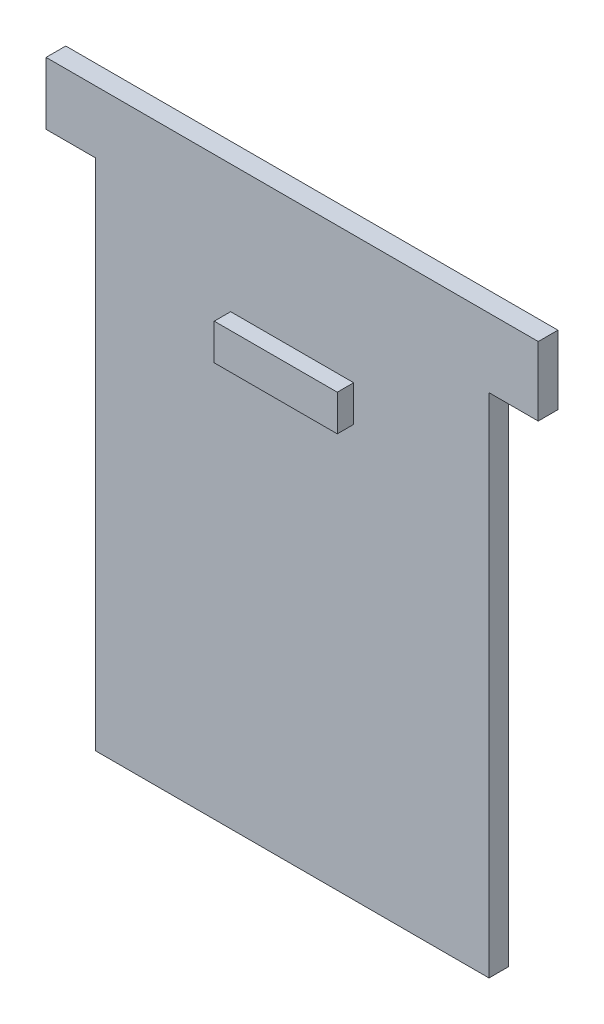
ISO-10303-21;
HEADER;
FILE_DESCRIPTION(('STEP AP214'),'2;1');
FILE_NAME('part.step','',(''),(''),'','','');
FILE_SCHEMA(('AUTOMOTIVE_DESIGN { 1 0 10303 214 1 1 1 1 }'));
ENDSEC;
DATA;
#1=APPLICATION_CONTEXT('core data for automotive mechanical design processes');
#2=APPLICATION_PROTOCOL_DEFINITION('international standard','automotive_design',2000,#1);
#3=PRODUCT_CONTEXT('',#1,'mechanical');
#4=PRODUCT('Part','Part','',(#3));
#5=PRODUCT_RELATED_PRODUCT_CATEGORY('part','',(#4));
#6=PRODUCT_DEFINITION_FORMATION('','',#4);
#7=PRODUCT_DEFINITION_CONTEXT('part definition',#1,'design');
#8=PRODUCT_DEFINITION('design','',#6,#7);
#9=PRODUCT_DEFINITION_SHAPE('','',#8);
#10=(LENGTH_UNIT() NAMED_UNIT(*) SI_UNIT(.MILLI.,.METRE.));
#11=(NAMED_UNIT(*) PLANE_ANGLE_UNIT() SI_UNIT($,.RADIAN.));
#12=(NAMED_UNIT(*) SI_UNIT($,.STERADIAN.) SOLID_ANGLE_UNIT());
#13=UNCERTAINTY_MEASURE_WITH_UNIT(LENGTH_MEASURE(1.E-05),#10,'distance_accuracy_value','');
#14=(GEOMETRIC_REPRESENTATION_CONTEXT(3) GLOBAL_UNCERTAINTY_ASSIGNED_CONTEXT((#13)) GLOBAL_UNIT_ASSIGNED_CONTEXT((#10,
#11,#12)) REPRESENTATION_CONTEXT('',''));
#15=CARTESIAN_POINT('',(0.,0.,0.));
#16=DIRECTION('',(0.,0.,1.));
#17=DIRECTION('',(1.,0.,0.));
#18=AXIS2_PLACEMENT_3D('',#15,#16,#17);
#19=CARTESIAN_POINT('',(0.,0.,12.));
#20=DIRECTION('',(0.,0.,-1.));
#21=DIRECTION('',(-1.,0.,0.));
#22=AXIS2_PLACEMENT_3D('',#19,#20,#21);
#23=PLANE('',#22);
#24=DIRECTION('',(0.,-1.,0.));
#25=VECTOR('',#24,1.);
#26=CARTESIAN_POINT('',(0.,-38.,12.));
#27=LINE('',#26,#25);
#28=CARTESIAN_POINT('',(0.,0.,12.));
#29=VERTEX_POINT('',#28);
#30=CARTESIAN_POINT('',(0.,-38.,12.));
#31=VERTEX_POINT('',#30);
#32=EDGE_CURVE('E160',#29,#31,#27,.T.);
#33=ORIENTED_EDGE('',*,*,#32,.T.);
#34=DIRECTION('',(1.,0.,0.));
#35=VECTOR('',#34,1.);
#36=CARTESIAN_POINT('',(30.,-38.,12.));
#37=LINE('',#36,#35);
#38=CARTESIAN_POINT('',(30.,-38.,12.));
#39=VERTEX_POINT('',#38);
#40=EDGE_CURVE('E163',#31,#39,#37,.T.);
#41=ORIENTED_EDGE('',*,*,#40,.T.);
#42=DIRECTION('',(0.,-1.,0.));
#43=VECTOR('',#42,1.);
#44=CARTESIAN_POINT('',(30.,-351.,12.));
#45=LINE('',#44,#43);
#46=CARTESIAN_POINT('',(30.,-351.,12.));
#47=VERTEX_POINT('',#46);
#48=EDGE_CURVE('E166',#39,#47,#45,.T.);
#49=ORIENTED_EDGE('',*,*,#48,.T.);
#50=DIRECTION('',(1.,0.,0.));
#51=VECTOR('',#50,1.);
#52=CARTESIAN_POINT('',(270.,-351.,12.));
#53=LINE('',#52,#51);
#54=CARTESIAN_POINT('',(270.,-351.,12.));
#55=VERTEX_POINT('',#54);
#56=EDGE_CURVE('E168',#47,#55,#53,.T.);
#57=ORIENTED_EDGE('',*,*,#56,.T.);
#58=DIRECTION('',(0.,1.,0.));
#59=VECTOR('',#58,1.);
#60=CARTESIAN_POINT('',(270.,-42.,12.));
#61=LINE('',#60,#59);
#62=CARTESIAN_POINT('',(270.,-42.,12.));
#63=VERTEX_POINT('',#62);
#64=EDGE_CURVE('E170',#55,#63,#61,.T.);
#65=ORIENTED_EDGE('',*,*,#64,.T.);
#66=DIRECTION('',(1.,0.,0.));
#67=VECTOR('',#66,1.);
#68=CARTESIAN_POINT('',(300.,-42.,12.));
#69=LINE('',#68,#67);
#70=CARTESIAN_POINT('',(300.,-42.,12.));
#71=VERTEX_POINT('',#70);
#72=EDGE_CURVE('E172',#63,#71,#69,.T.);
#73=ORIENTED_EDGE('',*,*,#72,.T.);
#74=DIRECTION('',(0.,1.,0.));
#75=VECTOR('',#74,1.);
#76=CARTESIAN_POINT('',(300.,0.,12.));
#77=LINE('',#76,#75);
#78=CARTESIAN_POINT('',(300.,0.,12.));
#79=VERTEX_POINT('',#78);
#80=EDGE_CURVE('E174',#71,#79,#77,.T.);
#81=ORIENTED_EDGE('',*,*,#80,.T.);
#82=DIRECTION('',(-1.,0.,0.));
#83=VECTOR('',#82,1.);
#84=CARTESIAN_POINT('',(0.,0.,12.));
#85=LINE('',#84,#83);
#86=EDGE_CURVE('E176',#79,#29,#85,.T.);
#87=ORIENTED_EDGE('',*,*,#86,.T.);
#88=EDGE_LOOP('',(#33,#41,#49,#57,#65,#73,#81,#87));
#89=FACE_BOUND('',#88,.T.);
#90=DIRECTION('',(0.,-1.,0.));
#91=VECTOR('',#90,1.);
#92=CARTESIAN_POINT('',(112.5,-78.,12.));
#93=LINE('',#92,#91);
#94=CARTESIAN_POINT('',(112.5,-78.,12.));
#95=VERTEX_POINT('',#94);
#96=CARTESIAN_POINT('',(112.5,-100.,12.));
#97=VERTEX_POINT('',#96);
#98=EDGE_CURVE('E150',#95,#97,#93,.T.);
#99=ORIENTED_EDGE('',*,*,#98,.F.);
#100=DIRECTION('',(-1.,0.,0.));
#101=VECTOR('',#100,1.);
#102=CARTESIAN_POINT('',(112.5,-78.,12.));
#103=LINE('',#102,#101);
#104=CARTESIAN_POINT('',(187.5,-78.,12.));
#105=VERTEX_POINT('',#104);
#106=EDGE_CURVE('E147',#105,#95,#103,.T.);
#107=ORIENTED_EDGE('',*,*,#106,.F.);
#108=DIRECTION('',(0.,1.,0.));
#109=VECTOR('',#108,1.);
#110=CARTESIAN_POINT('',(187.5,-78.,12.));
#111=LINE('',#110,#109);
#112=CARTESIAN_POINT('',(187.5,-100.,12.));
#113=VERTEX_POINT('',#112);
#114=EDGE_CURVE('E61',#113,#105,#111,.T.);
#115=ORIENTED_EDGE('',*,*,#114,.F.);
#116=DIRECTION('',(1.,0.,0.));
#117=VECTOR('',#116,1.);
#118=CARTESIAN_POINT('',(112.5,-100.,12.));
#119=LINE('',#118,#117);
#120=EDGE_CURVE('E56',#97,#113,#119,.T.);
#121=ORIENTED_EDGE('',*,*,#120,.F.);
#122=EDGE_LOOP('',(#99,#107,#115,#121));
#123=FACE_BOUND('',#122,.T.);
#124=ADVANCED_FACE('F41',(#89,#123),#23,.F.);
#125=CARTESIAN_POINT('',(0.,-38.,12.));
#126=DIRECTION('',(1.,0.,0.));
#127=DIRECTION('',(0.,0.,-1.));
#128=AXIS2_PLACEMENT_3D('',#125,#126,#127);
#129=PLANE('',#128);
#130=DIRECTION('',(0.,-1.,0.));
#131=VECTOR('',#130,1.);
#132=CARTESIAN_POINT('',(0.,-38.,0.));
#133=LINE('',#132,#131);
#134=CARTESIAN_POINT('',(0.,0.,0.));
#135=VERTEX_POINT('',#134);
#136=CARTESIAN_POINT('',(0.,-38.,0.));
#137=VERTEX_POINT('',#136);
#138=EDGE_CURVE('E151',#135,#137,#133,.T.);
#139=ORIENTED_EDGE('',*,*,#138,.T.);
#140=DIRECTION('',(0.,0.,-1.));
#141=VECTOR('',#140,1.);
#142=CARTESIAN_POINT('',(0.,-38.,12.));
#143=LINE('',#142,#141);
#144=EDGE_CURVE('E11',#31,#137,#143,.T.);
#145=ORIENTED_EDGE('',*,*,#144,.F.);
#146=ORIENTED_EDGE('',*,*,#32,.F.);
#147=DIRECTION('',(0.,0.,-1.));
#148=VECTOR('',#147,1.);
#149=CARTESIAN_POINT('',(0.,0.,12.));
#150=LINE('',#149,#148);
#151=EDGE_CURVE('E177',#29,#135,#150,.T.);
#152=ORIENTED_EDGE('',*,*,#151,.T.);
#153=EDGE_LOOP('',(#139,#145,#146,#152));
#154=FACE_BOUND('',#153,.T.);
#155=ADVANCED_FACE('F43',(#154),#129,.F.);
#156=CARTESIAN_POINT('',(30.,-38.,12.));
#157=DIRECTION('',(0.,1.,0.));
#158=DIRECTION('',(-1.,0.,0.));
#159=AXIS2_PLACEMENT_3D('',#156,#157,#158);
#160=PLANE('',#159);
#161=DIRECTION('',(1.,0.,0.));
#162=VECTOR('',#161,1.);
#163=CARTESIAN_POINT('',(30.,-38.,0.));
#164=LINE('',#163,#162);
#165=CARTESIAN_POINT('',(30.,-38.,0.));
#166=VERTEX_POINT('',#165);
#167=EDGE_CURVE('E154',#137,#166,#164,.T.);
#168=ORIENTED_EDGE('',*,*,#167,.T.);
#169=DIRECTION('',(0.,0.,-1.));
#170=VECTOR('',#169,1.);
#171=CARTESIAN_POINT('',(30.,-38.,12.));
#172=LINE('',#171,#170);
#173=EDGE_CURVE('E49',#39,#166,#172,.T.);
#174=ORIENTED_EDGE('',*,*,#173,.F.);
#175=ORIENTED_EDGE('',*,*,#40,.F.);
#176=ORIENTED_EDGE('',*,*,#144,.T.);
#177=EDGE_LOOP('',(#168,#174,#175,#176));
#178=FACE_BOUND('',#177,.T.);
#179=ADVANCED_FACE('F234',(#178),#160,.F.);
#180=CARTESIAN_POINT('',(30.,-351.,12.));
#181=DIRECTION('',(1.,0.,0.));
#182=DIRECTION('',(0.,0.,-1.));
#183=AXIS2_PLACEMENT_3D('',#180,#181,#182);
#184=PLANE('',#183);
#185=DIRECTION('',(0.,-1.,0.));
#186=VECTOR('',#185,1.);
#187=CARTESIAN_POINT('',(30.,-351.,0.));
#188=LINE('',#187,#186);
#189=CARTESIAN_POINT('',(30.,-351.,0.));
#190=VERTEX_POINT('',#189);
#191=EDGE_CURVE('E180',#166,#190,#188,.T.);
#192=ORIENTED_EDGE('',*,*,#191,.T.);
#193=DIRECTION('',(0.,0.,-1.));
#194=VECTOR('',#193,1.);
#195=CARTESIAN_POINT('',(30.,-351.,12.));
#196=LINE('',#195,#194);
#197=EDGE_CURVE('E205',#47,#190,#196,.T.);
#198=ORIENTED_EDGE('',*,*,#197,.F.);
#199=ORIENTED_EDGE('',*,*,#48,.F.);
#200=ORIENTED_EDGE('',*,*,#173,.T.);
#201=EDGE_LOOP('',(#192,#198,#199,#200));
#202=FACE_BOUND('',#201,.T.);
#203=ADVANCED_FACE('F212',(#202),#184,.F.);
#204=CARTESIAN_POINT('',(270.,-351.,12.));
#205=DIRECTION('',(0.,1.,0.));
#206=DIRECTION('',(-1.,0.,0.));
#207=AXIS2_PLACEMENT_3D('',#204,#205,#206);
#208=PLANE('',#207);
#209=DIRECTION('',(1.,0.,0.));
#210=VECTOR('',#209,1.);
#211=CARTESIAN_POINT('',(270.,-351.,0.));
#212=LINE('',#211,#210);
#213=CARTESIAN_POINT('',(270.,-351.,0.));
#214=VERTEX_POINT('',#213);
#215=EDGE_CURVE('E182',#190,#214,#212,.T.);
#216=ORIENTED_EDGE('',*,*,#215,.T.);
#217=DIRECTION('',(0.,0.,-1.));
#218=VECTOR('',#217,1.);
#219=CARTESIAN_POINT('',(270.,-351.,12.));
#220=LINE('',#219,#218);
#221=EDGE_CURVE('E202',#55,#214,#220,.T.);
#222=ORIENTED_EDGE('',*,*,#221,.F.);
#223=ORIENTED_EDGE('',*,*,#56,.F.);
#224=ORIENTED_EDGE('',*,*,#197,.T.);
#225=EDGE_LOOP('',(#216,#222,#223,#224));
#226=FACE_BOUND('',#225,.T.);
#227=ADVANCED_FACE('F223',(#226),#208,.F.);
#228=CARTESIAN_POINT('',(270.,-42.,12.));
#229=DIRECTION('',(-1.,0.,0.));
#230=DIRECTION('',(0.,-1.,0.));
#231=AXIS2_PLACEMENT_3D('',#228,#229,#230);
#232=PLANE('',#231);
#233=DIRECTION('',(0.,1.,0.));
#234=VECTOR('',#233,1.);
#235=CARTESIAN_POINT('',(270.,-42.,0.));
#236=LINE('',#235,#234);
#237=CARTESIAN_POINT('',(270.,-42.,0.));
#238=VERTEX_POINT('',#237);
#239=EDGE_CURVE('E184',#214,#238,#236,.T.);
#240=ORIENTED_EDGE('',*,*,#239,.T.);
#241=DIRECTION('',(0.,0.,-1.));
#242=VECTOR('',#241,1.);
#243=CARTESIAN_POINT('',(270.,-42.,12.));
#244=LINE('',#243,#242);
#245=EDGE_CURVE('E199',#63,#238,#244,.T.);
#246=ORIENTED_EDGE('',*,*,#245,.F.);
#247=ORIENTED_EDGE('',*,*,#64,.F.);
#248=ORIENTED_EDGE('',*,*,#221,.T.);
#249=EDGE_LOOP('',(#240,#246,#247,#248));
#250=FACE_BOUND('',#249,.T.);
#251=ADVANCED_FACE('F227',(#250),#232,.F.);
#252=CARTESIAN_POINT('',(300.,-42.,12.));
#253=DIRECTION('',(0.,1.,0.));
#254=DIRECTION('',(0.,0.,1.));
#255=AXIS2_PLACEMENT_3D('',#252,#253,#254);
#256=PLANE('',#255);
#257=DIRECTION('',(1.,0.,0.));
#258=VECTOR('',#257,1.);
#259=CARTESIAN_POINT('',(300.,-42.,0.));
#260=LINE('',#259,#258);
#261=CARTESIAN_POINT('',(300.,-42.,0.));
#262=VERTEX_POINT('',#261);
#263=EDGE_CURVE('E186',#238,#262,#260,.T.);
#264=ORIENTED_EDGE('',*,*,#263,.T.);
#265=DIRECTION('',(0.,0.,-1.));
#266=VECTOR('',#265,1.);
#267=CARTESIAN_POINT('',(300.,-42.,12.));
#268=LINE('',#267,#266);
#269=EDGE_CURVE('E196',#71,#262,#268,.T.);
#270=ORIENTED_EDGE('',*,*,#269,.F.);
#271=ORIENTED_EDGE('',*,*,#72,.F.);
#272=ORIENTED_EDGE('',*,*,#245,.T.);
#273=EDGE_LOOP('',(#264,#270,#271,#272));
#274=FACE_BOUND('',#273,.T.);
#275=ADVANCED_FACE('F247',(#274),#256,.F.);
#276=CARTESIAN_POINT('',(300.,0.,12.));
#277=DIRECTION('',(-1.,0.,0.));
#278=DIRECTION('',(0.,0.,1.));
#279=AXIS2_PLACEMENT_3D('',#276,#277,#278);
#280=PLANE('',#279);
#281=DIRECTION('',(0.,1.,0.));
#282=VECTOR('',#281,1.);
#283=CARTESIAN_POINT('',(300.,0.,0.));
#284=LINE('',#283,#282);
#285=CARTESIAN_POINT('',(300.,0.,0.));
#286=VERTEX_POINT('',#285);
#287=EDGE_CURVE('E188',#262,#286,#284,.T.);
#288=ORIENTED_EDGE('',*,*,#287,.T.);
#289=DIRECTION('',(0.,0.,-1.));
#290=VECTOR('',#289,1.);
#291=CARTESIAN_POINT('',(300.,0.,12.));
#292=LINE('',#291,#290);
#293=EDGE_CURVE('E193',#79,#286,#292,.T.);
#294=ORIENTED_EDGE('',*,*,#293,.F.);
#295=ORIENTED_EDGE('',*,*,#80,.F.);
#296=ORIENTED_EDGE('',*,*,#269,.T.);
#297=EDGE_LOOP('',(#288,#294,#295,#296));
#298=FACE_BOUND('',#297,.T.);
#299=ADVANCED_FACE('F245',(#298),#280,.F.);
#300=CARTESIAN_POINT('',(0.,0.,12.));
#301=DIRECTION('',(0.,-1.,0.));
#302=DIRECTION('',(0.,0.,-1.));
#303=AXIS2_PLACEMENT_3D('',#300,#301,#302);
#304=PLANE('',#303);
#305=DIRECTION('',(-1.,0.,0.));
#306=VECTOR('',#305,1.);
#307=CARTESIAN_POINT('',(0.,0.,0.));
#308=LINE('',#307,#306);
#309=EDGE_CURVE('E164',#286,#135,#308,.T.);
#310=ORIENTED_EDGE('',*,*,#309,.T.);
#311=ORIENTED_EDGE('',*,*,#151,.F.);
#312=ORIENTED_EDGE('',*,*,#86,.F.);
#313=ORIENTED_EDGE('',*,*,#293,.T.);
#314=EDGE_LOOP('',(#310,#311,#312,#313));
#315=FACE_BOUND('',#314,.T.);
#316=ADVANCED_FACE('F240',(#315),#304,.F.);
#317=CARTESIAN_POINT('',(0.,0.,0.));
#318=DIRECTION('',(0.,0.,-1.));
#319=DIRECTION('',(-1.,0.,0.));
#320=AXIS2_PLACEMENT_3D('',#317,#318,#319);
#321=PLANE('',#320);
#322=ORIENTED_EDGE('',*,*,#138,.F.);
#323=ORIENTED_EDGE('',*,*,#309,.F.);
#324=ORIENTED_EDGE('',*,*,#287,.F.);
#325=ORIENTED_EDGE('',*,*,#263,.F.);
#326=ORIENTED_EDGE('',*,*,#239,.F.);
#327=ORIENTED_EDGE('',*,*,#215,.F.);
#328=ORIENTED_EDGE('',*,*,#191,.F.);
#329=ORIENTED_EDGE('',*,*,#167,.F.);
#330=EDGE_LOOP('',(#322,#323,#324,#325,#326,#327,#328,#329));
#331=FACE_BOUND('',#330,.T.);
#332=ADVANCED_FACE('F218',(#331),#321,.T.);
#333=CARTESIAN_POINT('',(112.5,-78.,22.));
#334=DIRECTION('',(1.,0.,0.));
#335=DIRECTION('',(0.,0.,-1.));
#336=AXIS2_PLACEMENT_3D('',#333,#334,#335);
#337=PLANE('',#336);
#338=ORIENTED_EDGE('',*,*,#98,.T.);
#339=DIRECTION('',(0.,0.,-1.));
#340=VECTOR('',#339,1.);
#341=CARTESIAN_POINT('',(112.5,-100.,22.));
#342=LINE('',#341,#340);
#343=CARTESIAN_POINT('',(112.5,-100.,22.));
#344=VERTEX_POINT('',#343);
#345=EDGE_CURVE('E131',#344,#97,#342,.T.);
#346=ORIENTED_EDGE('',*,*,#345,.F.);
#347=DIRECTION('',(0.,-1.,0.));
#348=VECTOR('',#347,1.);
#349=CARTESIAN_POINT('',(112.5,-78.,22.));
#350=LINE('',#349,#348);
#351=CARTESIAN_POINT('',(112.5,-78.,22.));
#352=VERTEX_POINT('',#351);
#353=EDGE_CURVE('E138',#352,#344,#350,.T.);
#354=ORIENTED_EDGE('',*,*,#353,.F.);
#355=DIRECTION('',(0.,0.,-1.));
#356=VECTOR('',#355,1.);
#357=CARTESIAN_POINT('',(112.5,-78.,22.));
#358=LINE('',#357,#356);
#359=EDGE_CURVE('E328',#352,#95,#358,.T.);
#360=ORIENTED_EDGE('',*,*,#359,.T.);
#361=EDGE_LOOP('',(#338,#346,#354,#360));
#362=FACE_BOUND('',#361,.T.);
#363=ADVANCED_FACE('F149',(#362),#337,.F.);
#364=CARTESIAN_POINT('',(112.5,-100.,22.));
#365=DIRECTION('',(0.,1.,0.));
#366=DIRECTION('',(0.,0.,1.));
#367=AXIS2_PLACEMENT_3D('',#364,#365,#366);
#368=PLANE('',#367);
#369=ORIENTED_EDGE('',*,*,#120,.T.);
#370=DIRECTION('',(0.,0.,-1.));
#371=VECTOR('',#370,1.);
#372=CARTESIAN_POINT('',(187.5,-100.,22.));
#373=LINE('',#372,#371);
#374=CARTESIAN_POINT('',(187.5,-100.,22.));
#375=VERTEX_POINT('',#374);
#376=EDGE_CURVE('E134',#375,#113,#373,.T.);
#377=ORIENTED_EDGE('',*,*,#376,.F.);
#378=DIRECTION('',(1.,0.,0.));
#379=VECTOR('',#378,1.);
#380=CARTESIAN_POINT('',(112.5,-100.,22.));
#381=LINE('',#380,#379);
#382=EDGE_CURVE('E127',#344,#375,#381,.T.);
#383=ORIENTED_EDGE('',*,*,#382,.F.);
#384=ORIENTED_EDGE('',*,*,#345,.T.);
#385=EDGE_LOOP('',(#369,#377,#383,#384));
#386=FACE_BOUND('',#385,.T.);
#387=ADVANCED_FACE('F129',(#386),#368,.F.);
#388=CARTESIAN_POINT('',(187.5,-78.,22.));
#389=DIRECTION('',(-1.,0.,0.));
#390=DIRECTION('',(0.,0.,1.));
#391=AXIS2_PLACEMENT_3D('',#388,#389,#390);
#392=PLANE('',#391);
#393=ORIENTED_EDGE('',*,*,#114,.T.);
#394=DIRECTION('',(0.,0.,-1.));
#395=VECTOR('',#394,1.);
#396=CARTESIAN_POINT('',(187.5,-78.,22.));
#397=LINE('',#396,#395);
#398=CARTESIAN_POINT('',(187.5,-78.,22.));
#399=VERTEX_POINT('',#398);
#400=EDGE_CURVE('E156',#399,#105,#397,.T.);
#401=ORIENTED_EDGE('',*,*,#400,.F.);
#402=DIRECTION('',(0.,1.,0.));
#403=VECTOR('',#402,1.);
#404=CARTESIAN_POINT('',(187.5,-78.,22.));
#405=LINE('',#404,#403);
#406=EDGE_CURVE('E137',#375,#399,#405,.T.);
#407=ORIENTED_EDGE('',*,*,#406,.F.);
#408=ORIENTED_EDGE('',*,*,#376,.T.);
#409=EDGE_LOOP('',(#393,#401,#407,#408));
#410=FACE_BOUND('',#409,.T.);
#411=ADVANCED_FACE('F297',(#410),#392,.F.);
#412=CARTESIAN_POINT('',(112.5,-78.,22.));
#413=DIRECTION('',(0.,-1.,0.));
#414=DIRECTION('',(0.,0.,-1.));
#415=AXIS2_PLACEMENT_3D('',#412,#413,#414);
#416=PLANE('',#415);
#417=ORIENTED_EDGE('',*,*,#106,.T.);
#418=ORIENTED_EDGE('',*,*,#359,.F.);
#419=DIRECTION('',(-1.,0.,0.));
#420=VECTOR('',#419,1.);
#421=CARTESIAN_POINT('',(112.5,-78.,22.));
#422=LINE('',#421,#420);
#423=EDGE_CURVE('E143',#399,#352,#422,.T.);
#424=ORIENTED_EDGE('',*,*,#423,.F.);
#425=ORIENTED_EDGE('',*,*,#400,.T.);
#426=EDGE_LOOP('',(#417,#418,#424,#425));
#427=FACE_BOUND('',#426,.T.);
#428=ADVANCED_FACE('F305',(#427),#416,.F.);
#429=CARTESIAN_POINT('',(0.,0.,22.));
#430=DIRECTION('',(0.,0.,1.));
#431=DIRECTION('',(1.,0.,0.));
#432=AXIS2_PLACEMENT_3D('',#429,#430,#431);
#433=PLANE('',#432);
#434=ORIENTED_EDGE('',*,*,#353,.T.);
#435=ORIENTED_EDGE('',*,*,#382,.T.);
#436=ORIENTED_EDGE('',*,*,#406,.T.);
#437=ORIENTED_EDGE('',*,*,#423,.T.);
#438=EDGE_LOOP('',(#434,#435,#436,#437));
#439=FACE_BOUND('',#438,.T.);
#440=ADVANCED_FACE('F141',(#439),#433,.T.);
#441=CLOSED_SHELL('',(#124,#155,#179,#203,#227,#251,#275,#299,#316,#332,#363,#387,#411,#428,#440));
#442=MANIFOLD_SOLID_BREP('B2',#441);
#443=ADVANCED_BREP_SHAPE_REPRESENTATION('',(#18,#442),#14);
#444=SHAPE_DEFINITION_REPRESENTATION(#9,#443);
ENDSEC;
END-ISO-10303-21;
